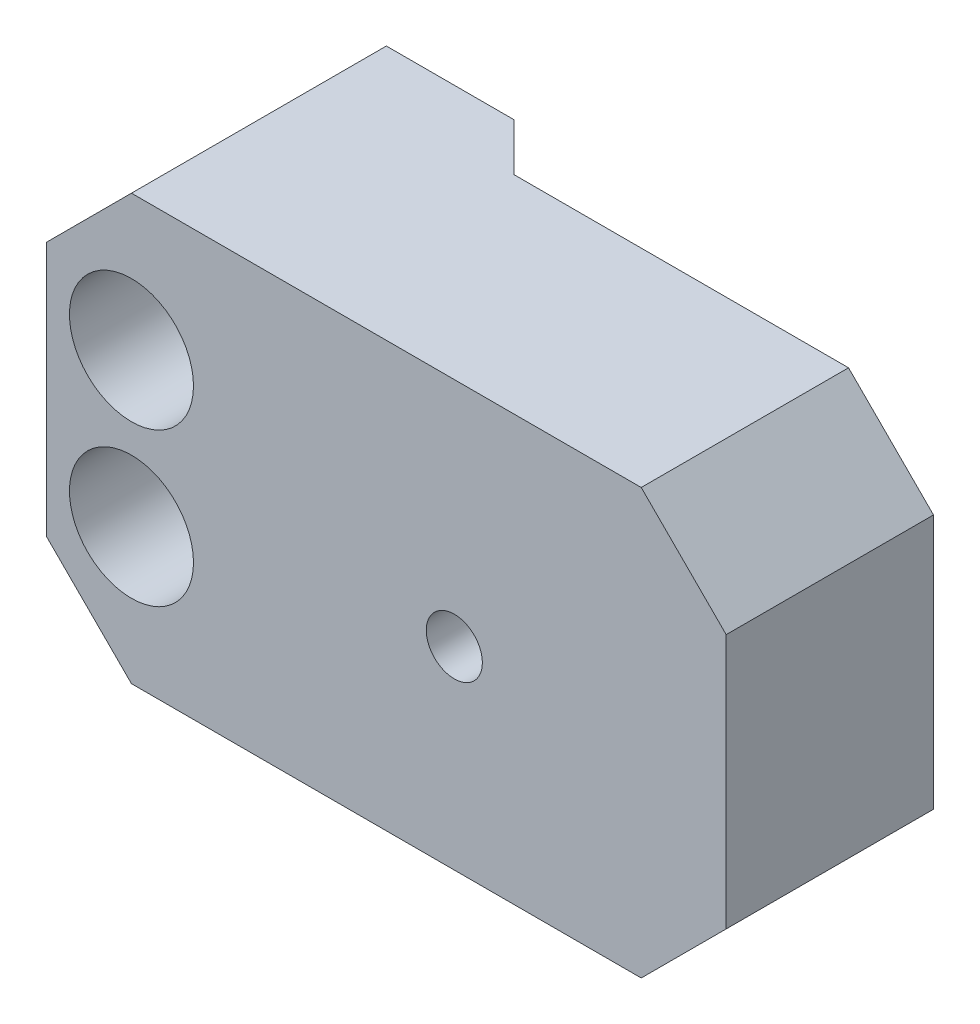
ISO-10303-21;
HEADER;
FILE_DESCRIPTION(('STEP AP214'),'2;1');
FILE_NAME('part.step','',(''),(''),'','','');
FILE_SCHEMA(('AUTOMOTIVE_DESIGN { 1 0 10303 214 1 1 1 1 }'));
ENDSEC;
DATA;
#1=APPLICATION_CONTEXT('core data for automotive mechanical design processes');
#2=APPLICATION_PROTOCOL_DEFINITION('international standard','automotive_design',2000,#1);
#3=PRODUCT_CONTEXT('',#1,'mechanical');
#4=PRODUCT('Part','Part','',(#3));
#5=PRODUCT_RELATED_PRODUCT_CATEGORY('part','',(#4));
#6=PRODUCT_DEFINITION_FORMATION('','',#4);
#7=PRODUCT_DEFINITION_CONTEXT('part definition',#1,'design');
#8=PRODUCT_DEFINITION('design','',#6,#7);
#9=PRODUCT_DEFINITION_SHAPE('','',#8);
#10=(LENGTH_UNIT() NAMED_UNIT(*) SI_UNIT(.MILLI.,.METRE.));
#11=(NAMED_UNIT(*) PLANE_ANGLE_UNIT() SI_UNIT($,.RADIAN.));
#12=(NAMED_UNIT(*) SI_UNIT($,.STERADIAN.) SOLID_ANGLE_UNIT());
#13=UNCERTAINTY_MEASURE_WITH_UNIT(LENGTH_MEASURE(1.E-05),#10,'distance_accuracy_value','');
#14=(GEOMETRIC_REPRESENTATION_CONTEXT(3) GLOBAL_UNCERTAINTY_ASSIGNED_CONTEXT((#13)) GLOBAL_UNIT_ASSIGNED_CONTEXT((#10,
#11,#12)) REPRESENTATION_CONTEXT('',''));
#15=CARTESIAN_POINT('',(0.,0.,0.));
#16=DIRECTION('',(0.,0.,1.));
#17=DIRECTION('',(1.,0.,0.));
#18=AXIS2_PLACEMENT_3D('',#15,#16,#17);
#19=CARTESIAN_POINT('',(-19.,-3.39389348937327,46.));
#20=DIRECTION('',(0.,0.,-1.));
#21=DIRECTION('',(-1.,0.,0.));
#22=AXIS2_PLACEMENT_3D('',#19,#20,#21);
#23=CYLINDRICAL_SURFACE('',#22,1.75);
#24=CARTESIAN_POINT('',(-19.,-3.39389348937327,31.));
#25=DIRECTION('',(0.,0.,1.));
#26=DIRECTION('',(1.,0.,0.));
#27=AXIS2_PLACEMENT_3D('',#24,#25,#26);
#28=CIRCLE('',#27,1.75);
#29=CARTESIAN_POINT('',(-17.25,-3.39389348937327,31.));
#30=VERTEX_POINT('',#29);
#31=EDGE_CURVE('E269',#30,#30,#28,.T.);
#32=ORIENTED_EDGE('',*,*,#31,.F.);
#33=EDGE_LOOP('',(#32));
#34=FACE_BOUND('',#33,.T.);
#35=CARTESIAN_POINT('',(-19.,-3.39389348937327,34.5));
#36=DIRECTION('',(0.,0.,1.));
#37=DIRECTION('',(1.,0.,0.));
#38=AXIS2_PLACEMENT_3D('',#35,#36,#37);
#39=CIRCLE('',#38,1.75);
#40=CARTESIAN_POINT('',(-17.25,-3.39389348937327,34.5));
#41=VERTEX_POINT('',#40);
#42=EDGE_CURVE('E327',#41,#41,#39,.F.);
#43=ORIENTED_EDGE('',*,*,#42,.F.);
#44=EDGE_LOOP('',(#43));
#45=FACE_BOUND('',#44,.T.);
#46=ADVANCED_FACE('F39',(#34,#45),#23,.F.);
#47=CARTESIAN_POINT('',(-19.,5.60610651062673,46.));
#48=DIRECTION('',(0.,0.,-1.));
#49=DIRECTION('',(-1.,0.,0.));
#50=AXIS2_PLACEMENT_3D('',#47,#48,#49);
#51=CYLINDRICAL_SURFACE('',#50,1.75);
#52=CARTESIAN_POINT('',(-19.,5.60610651062673,31.));
#53=DIRECTION('',(0.,0.,1.));
#54=DIRECTION('',(1.,0.,0.));
#55=AXIS2_PLACEMENT_3D('',#52,#53,#54);
#56=CIRCLE('',#55,1.75);
#57=CARTESIAN_POINT('',(-17.25,5.60610651062673,31.));
#58=VERTEX_POINT('',#57);
#59=EDGE_CURVE('E265',#58,#58,#56,.T.);
#60=ORIENTED_EDGE('',*,*,#59,.F.);
#61=EDGE_LOOP('',(#60));
#62=FACE_BOUND('',#61,.T.);
#63=CARTESIAN_POINT('',(-19.,5.60610651062673,34.5));
#64=DIRECTION('',(0.,0.,1.));
#65=DIRECTION('',(1.,0.,0.));
#66=AXIS2_PLACEMENT_3D('',#63,#64,#65);
#67=CIRCLE('',#66,1.75);
#68=CARTESIAN_POINT('',(-17.25,5.60610651062673,34.5));
#69=VERTEX_POINT('',#68);
#70=EDGE_CURVE('E320',#69,#69,#67,.T.);
#71=ORIENTED_EDGE('',*,*,#70,.T.);
#72=EDGE_LOOP('',(#71));
#73=FACE_BOUND('',#72,.T.);
#74=ADVANCED_FACE('F163',(#62,#73),#51,.F.);
#75=CARTESIAN_POINT('',(0.,0.,46.));
#76=DIRECTION('',(0.,0.,-1.));
#77=DIRECTION('',(-1.,0.,0.));
#78=AXIS2_PLACEMENT_3D('',#75,#76,#77);
#79=CYLINDRICAL_SURFACE('',#78,4.9);
#80=CARTESIAN_POINT('',(0.,0.,34.8));
#81=DIRECTION('',(0.,0.,1.));
#82=DIRECTION('',(1.,0.,0.));
#83=AXIS2_PLACEMENT_3D('',#80,#81,#82);
#84=CIRCLE('',#83,4.9);
#85=CARTESIAN_POINT('',(4.9,0.,34.8));
#86=VERTEX_POINT('',#85);
#87=EDGE_CURVE('E138',#86,#86,#84,.F.);
#88=ORIENTED_EDGE('',*,*,#87,.T.);
#89=EDGE_LOOP('',(#88));
#90=FACE_BOUND('',#89,.T.);
#91=CARTESIAN_POINT('',(0.,0.,42.5));
#92=DIRECTION('',(0.,0.,1.));
#93=DIRECTION('',(1.,0.,0.));
#94=AXIS2_PLACEMENT_3D('',#91,#92,#93);
#95=CIRCLE('',#94,4.9);
#96=CARTESIAN_POINT('',(4.9,0.,42.5));
#97=VERTEX_POINT('',#96);
#98=EDGE_CURVE('E256',#97,#97,#95,.F.);
#99=ORIENTED_EDGE('',*,*,#98,.F.);
#100=EDGE_LOOP('',(#99));
#101=FACE_BOUND('',#100,.T.);
#102=ADVANCED_FACE('F169',(#90,#101),#79,.F.);
#103=CARTESIAN_POINT('',(0.,0.,46.));
#104=DIRECTION('',(0.,0.,1.));
#105=DIRECTION('',(1.,0.,0.));
#106=AXIS2_PLACEMENT_3D('',#103,#104,#105);
#107=PLANE('',#106);
#108=CARTESIAN_POINT('',(-19.,-3.39389348937327,46.));
#109=DIRECTION('',(0.,0.,1.));
#110=DIRECTION('',(1.,0.,0.));
#111=AXIS2_PLACEMENT_3D('',#108,#109,#110);
#112=CIRCLE('',#111,3.65);
#113=CARTESIAN_POINT('',(-15.35,-3.39389348937327,46.));
#114=VERTEX_POINT('',#113);
#115=EDGE_CURVE('E330',#114,#114,#112,.T.);
#116=ORIENTED_EDGE('',*,*,#115,.F.);
#117=EDGE_LOOP('',(#116));
#118=FACE_BOUND('',#117,.T.);
#119=CARTESIAN_POINT('',(-19.,5.60610651062673,46.));
#120=DIRECTION('',(0.,0.,1.));
#121=DIRECTION('',(1.,0.,0.));
#122=AXIS2_PLACEMENT_3D('',#119,#120,#121);
#123=CIRCLE('',#122,3.65);
#124=CARTESIAN_POINT('',(-15.35,5.60610651062673,46.));
#125=VERTEX_POINT('',#124);
#126=EDGE_CURVE('E335',#125,#125,#123,.T.);
#127=ORIENTED_EDGE('',*,*,#126,.F.);
#128=EDGE_LOOP('',(#127));
#129=FACE_BOUND('',#128,.T.);
#130=DIRECTION('',(0.,-1.,0.));
#131=VECTOR('',#130,1.);
#132=CARTESIAN_POINT('',(-24.,13.6061065106267,46.));
#133=LINE('',#132,#131);
#134=CARTESIAN_POINT('',(-24.,8.60610651062673,46.));
#135=VERTEX_POINT('',#134);
#136=CARTESIAN_POINT('',(-24.,-6.39389348937327,46.));
#137=VERTEX_POINT('',#136);
#138=EDGE_CURVE('E272',#135,#137,#133,.T.);
#139=ORIENTED_EDGE('',*,*,#138,.T.);
#140=DIRECTION('',(-0.707106781186546,0.707106781186549,0.));
#141=VECTOR('',#140,1.);
#142=CARTESIAN_POINT('',(-15.1969467446867,-15.1969467446866,46.));
#143=LINE('',#142,#141);
#144=CARTESIAN_POINT('',(-19.,-11.3938934893733,46.));
#145=VERTEX_POINT('',#144);
#146=EDGE_CURVE('E305',#137,#145,#143,.F.);
#147=ORIENTED_EDGE('',*,*,#146,.T.);
#148=DIRECTION('',(1.,0.,0.));
#149=VECTOR('',#148,1.);
#150=CARTESIAN_POINT('',(-24.,-11.3938934893733,46.));
#151=LINE('',#150,#149);
#152=CARTESIAN_POINT('',(11.,-11.3938934893733,46.));
#153=VERTEX_POINT('',#152);
#154=EDGE_CURVE('E275',#145,#153,#151,.T.);
#155=ORIENTED_EDGE('',*,*,#154,.T.);
#156=DIRECTION('',(-0.707106781186548,-0.707106781186547,0.));
#157=VECTOR('',#156,1.);
#158=CARTESIAN_POINT('',(11.1969467446866,-11.1969467446866,46.));
#159=LINE('',#158,#157);
#160=CARTESIAN_POINT('',(16.,-6.39389348937328,46.));
#161=VERTEX_POINT('',#160);
#162=EDGE_CURVE('E303',#153,#161,#159,.F.);
#163=ORIENTED_EDGE('',*,*,#162,.T.);
#164=DIRECTION('',(0.,1.,0.));
#165=VECTOR('',#164,1.);
#166=CARTESIAN_POINT('',(16.,13.6061065106267,46.));
#167=LINE('',#166,#165);
#168=CARTESIAN_POINT('',(16.,8.60610651062671,46.));
#169=VERTEX_POINT('',#168);
#170=EDGE_CURVE('E278',#161,#169,#167,.T.);
#171=ORIENTED_EDGE('',*,*,#170,.T.);
#172=DIRECTION('',(0.707106781186546,-0.707106781186549,0.));
#173=VECTOR('',#172,1.);
#174=CARTESIAN_POINT('',(12.3030532553134,12.3030532553133,46.));
#175=LINE('',#174,#173);
#176=CARTESIAN_POINT('',(11.,13.6061065106267,46.));
#177=VERTEX_POINT('',#176);
#178=EDGE_CURVE('E301',#169,#177,#175,.F.);
#179=ORIENTED_EDGE('',*,*,#178,.T.);
#180=DIRECTION('',(-1.,0.,0.));
#181=VECTOR('',#180,1.);
#182=CARTESIAN_POINT('',(-24.,13.6061065106267,46.));
#183=LINE('',#182,#181);
#184=CARTESIAN_POINT('',(-19.,13.6061065106267,46.));
#185=VERTEX_POINT('',#184);
#186=EDGE_CURVE('E281',#177,#185,#183,.T.);
#187=ORIENTED_EDGE('',*,*,#186,.T.);
#188=DIRECTION('',(0.707106781186549,0.707106781186547,0.));
#189=VECTOR('',#188,1.);
#190=CARTESIAN_POINT('',(-16.3030532553133,16.3030532553134,46.));
#191=LINE('',#190,#189);
#192=EDGE_CURVE('E299',#185,#135,#191,.F.);
#193=ORIENTED_EDGE('',*,*,#192,.T.);
#194=EDGE_LOOP('',(#139,#147,#155,#163,#171,#179,#187,#193));
#195=FACE_BOUND('',#194,.T.);
#196=CARTESIAN_POINT('',(0.,0.,46.));
#197=DIRECTION('',(0.,0.,1.));
#198=DIRECTION('',(1.,0.,0.));
#199=AXIS2_PLACEMENT_3D('',#196,#197,#198);
#200=CIRCLE('',#199,1.65);
#201=CARTESIAN_POINT('',(1.65,0.,46.));
#202=VERTEX_POINT('',#201);
#203=EDGE_CURVE('E260',#202,#202,#200,.T.);
#204=ORIENTED_EDGE('',*,*,#203,.F.);
#205=EDGE_LOOP('',(#204));
#206=FACE_BOUND('',#205,.T.);
#207=ADVANCED_FACE('F178',(#118,#129,#195,#206),#107,.T.);
#208=CARTESIAN_POINT('',(0.,0.,31.));
#209=DIRECTION('',(0.,0.,1.));
#210=DIRECTION('',(1.,0.,0.));
#211=AXIS2_PLACEMENT_3D('',#208,#209,#210);
#212=PLANE('',#211);
#213=DIRECTION('',(1.,0.,0.));
#214=VECTOR('',#213,1.);
#215=CARTESIAN_POINT('',(-24.,-11.3938934893733,31.));
#216=LINE('',#215,#214);
#217=CARTESIAN_POINT('',(-19.,-11.3938934893733,31.));
#218=VERTEX_POINT('',#217);
#219=CARTESIAN_POINT('',(-11.5,-11.3938934893733,31.));
#220=VERTEX_POINT('',#219);
#221=EDGE_CURVE('E118',#218,#220,#216,.T.);
#222=ORIENTED_EDGE('',*,*,#221,.F.);
#223=DIRECTION('',(0.707106781186546,-0.707106781186549,0.));
#224=VECTOR('',#223,1.);
#225=CARTESIAN_POINT('',(-19.,-11.3938934893733,31.));
#226=LINE('',#225,#224);
#227=CARTESIAN_POINT('',(-24.,-6.39389348937327,31.));
#228=VERTEX_POINT('',#227);
#229=EDGE_CURVE('E292',#218,#228,#226,.F.);
#230=ORIENTED_EDGE('',*,*,#229,.T.);
#231=DIRECTION('',(0.,-1.,0.));
#232=VECTOR('',#231,1.);
#233=CARTESIAN_POINT('',(-24.,13.6061065106267,31.));
#234=LINE('',#233,#232);
#235=CARTESIAN_POINT('',(-24.,8.60610651062673,31.));
#236=VERTEX_POINT('',#235);
#237=EDGE_CURVE('E126',#236,#228,#234,.T.);
#238=ORIENTED_EDGE('',*,*,#237,.F.);
#239=DIRECTION('',(-0.707106781186549,-0.707106781186547,0.));
#240=VECTOR('',#239,1.);
#241=CARTESIAN_POINT('',(-24.,8.60610651062673,31.));
#242=LINE('',#241,#240);
#243=CARTESIAN_POINT('',(-19.,13.6061065106267,31.));
#244=VERTEX_POINT('',#243);
#245=EDGE_CURVE('E290',#236,#244,#242,.F.);
#246=ORIENTED_EDGE('',*,*,#245,.T.);
#247=DIRECTION('',(-1.,0.,0.));
#248=VECTOR('',#247,1.);
#249=CARTESIAN_POINT('',(-24.,13.6061065106267,31.));
#250=LINE('',#249,#248);
#251=CARTESIAN_POINT('',(-11.5,13.6061065106267,31.));
#252=VERTEX_POINT('',#251);
#253=EDGE_CURVE('E125',#252,#244,#250,.T.);
#254=ORIENTED_EDGE('',*,*,#253,.F.);
#255=DIRECTION('',(0.,1.,0.));
#256=VECTOR('',#255,1.);
#257=CARTESIAN_POINT('',(-11.5,-114.394893489373,31.));
#258=LINE('',#257,#256);
#259=EDGE_CURVE('E129',#220,#252,#258,.T.);
#260=ORIENTED_EDGE('',*,*,#259,.F.);
#261=EDGE_LOOP('',(#222,#230,#238,#246,#254,#260));
#262=FACE_BOUND('',#261,.T.);
#263=ORIENTED_EDGE('',*,*,#31,.T.);
#264=EDGE_LOOP('',(#263));
#265=FACE_BOUND('',#264,.T.);
#266=ORIENTED_EDGE('',*,*,#59,.T.);
#267=EDGE_LOOP('',(#266));
#268=FACE_BOUND('',#267,.T.);
#269=ADVANCED_FACE('F130',(#262,#265,#268),#212,.F.);
#270=CARTESIAN_POINT('',(-24.,13.6061065106267,46.));
#271=DIRECTION('',(1.,0.,0.));
#272=DIRECTION('',(0.,1.,0.));
#273=AXIS2_PLACEMENT_3D('',#270,#271,#272);
#274=PLANE('',#273);
#275=ORIENTED_EDGE('',*,*,#237,.T.);
#276=DIRECTION('',(0.,0.,1.));
#277=VECTOR('',#276,1.);
#278=CARTESIAN_POINT('',(-24.,-6.39389348937327,46.));
#279=LINE('',#278,#277);
#280=EDGE_CURVE('E297',#228,#137,#279,.T.);
#281=ORIENTED_EDGE('',*,*,#280,.T.);
#282=ORIENTED_EDGE('',*,*,#138,.F.);
#283=DIRECTION('',(0.,0.,-1.));
#284=VECTOR('',#283,1.);
#285=CARTESIAN_POINT('',(-24.,8.60610651062673,46.));
#286=LINE('',#285,#284);
#287=EDGE_CURVE('E294',#135,#236,#286,.T.);
#288=ORIENTED_EDGE('',*,*,#287,.T.);
#289=EDGE_LOOP('',(#275,#281,#282,#288));
#290=FACE_BOUND('',#289,.T.);
#291=ADVANCED_FACE('F185',(#290),#274,.F.);
#292=CARTESIAN_POINT('',(-24.,-11.3938934893733,46.));
#293=DIRECTION('',(0.,1.,0.));
#294=DIRECTION('',(0.,0.,1.));
#295=AXIS2_PLACEMENT_3D('',#292,#293,#294);
#296=PLANE('',#295);
#297=ORIENTED_EDGE('',*,*,#154,.F.);
#298=DIRECTION('',(0.,0.,-1.));
#299=VECTOR('',#298,1.);
#300=CARTESIAN_POINT('',(-19.,-11.3938934893733,46.));
#301=LINE('',#300,#299);
#302=EDGE_CURVE('E123',#145,#218,#301,.T.);
#303=ORIENTED_EDGE('',*,*,#302,.T.);
#304=ORIENTED_EDGE('',*,*,#221,.T.);
#305=DIRECTION('',(-0.707106781186552,0.,-0.707106781186543));
#306=VECTOR('',#305,1.);
#307=CARTESIAN_POINT('',(-10.2500000000001,-11.3938934893733,32.2499999999999));
#308=LINE('',#307,#306);
#309=CARTESIAN_POINT('',(-8.69999999999997,-11.3938934893733,33.8));
#310=VERTEX_POINT('',#309);
#311=EDGE_CURVE('E63',#220,#310,#308,.F.);
#312=ORIENTED_EDGE('',*,*,#311,.T.);
#313=DIRECTION('',(-1.,0.,0.));
#314=VECTOR('',#313,1.);
#315=CARTESIAN_POINT('',(16.,-11.3938934893733,33.8));
#316=LINE('',#315,#314);
#317=CARTESIAN_POINT('',(11.,-11.3938934893733,33.8));
#318=VERTEX_POINT('',#317);
#319=EDGE_CURVE('E251',#318,#310,#316,.T.);
#320=ORIENTED_EDGE('',*,*,#319,.F.);
#321=DIRECTION('',(0.,0.,1.));
#322=VECTOR('',#321,1.);
#323=CARTESIAN_POINT('',(11.,-11.3938934893733,46.));
#324=LINE('',#323,#322);
#325=EDGE_CURVE('E284',#318,#153,#324,.T.);
#326=ORIENTED_EDGE('',*,*,#325,.T.);
#327=EDGE_LOOP('',(#297,#303,#304,#312,#320,#326));
#328=FACE_BOUND('',#327,.T.);
#329=ADVANCED_FACE('F121',(#328),#296,.F.);
#330=CARTESIAN_POINT('',(16.,13.6061065106267,46.));
#331=DIRECTION('',(-1.,0.,0.));
#332=DIRECTION('',(0.,-1.,0.));
#333=AXIS2_PLACEMENT_3D('',#330,#331,#332);
#334=PLANE('',#333);
#335=ORIENTED_EDGE('',*,*,#170,.F.);
#336=DIRECTION('',(0.,0.,-1.));
#337=VECTOR('',#336,1.);
#338=CARTESIAN_POINT('',(16.,-6.39389348937328,46.));
#339=LINE('',#338,#337);
#340=CARTESIAN_POINT('',(16.,-6.39389348937328,33.8));
#341=VERTEX_POINT('',#340);
#342=EDGE_CURVE('E309',#161,#341,#339,.T.);
#343=ORIENTED_EDGE('',*,*,#342,.T.);
#344=DIRECTION('',(0.,1.,0.));
#345=VECTOR('',#344,1.);
#346=CARTESIAN_POINT('',(16.,-114.394893489373,33.8));
#347=LINE('',#346,#345);
#348=CARTESIAN_POINT('',(16.,8.60610651062671,33.8));
#349=VERTEX_POINT('',#348);
#350=EDGE_CURVE('E133',#341,#349,#347,.T.);
#351=ORIENTED_EDGE('',*,*,#350,.T.);
#352=DIRECTION('',(0.,0.,1.));
#353=VECTOR('',#352,1.);
#354=CARTESIAN_POINT('',(16.,8.60610651062671,46.));
#355=LINE('',#354,#353);
#356=EDGE_CURVE('E307',#349,#169,#355,.T.);
#357=ORIENTED_EDGE('',*,*,#356,.T.);
#358=EDGE_LOOP('',(#335,#343,#351,#357));
#359=FACE_BOUND('',#358,.T.);
#360=ADVANCED_FACE('F190',(#359),#334,.F.);
#361=CARTESIAN_POINT('',(-24.,13.6061065106267,46.));
#362=DIRECTION('',(0.,-1.,0.));
#363=DIRECTION('',(0.,0.,-1.));
#364=AXIS2_PLACEMENT_3D('',#361,#362,#363);
#365=PLANE('',#364);
#366=ORIENTED_EDGE('',*,*,#186,.F.);
#367=DIRECTION('',(0.,0.,-1.));
#368=VECTOR('',#367,1.);
#369=CARTESIAN_POINT('',(11.,13.6061065106267,46.));
#370=LINE('',#369,#368);
#371=CARTESIAN_POINT('',(11.,13.6061065106267,33.8));
#372=VERTEX_POINT('',#371);
#373=EDGE_CURVE('E317',#177,#372,#370,.T.);
#374=ORIENTED_EDGE('',*,*,#373,.T.);
#375=DIRECTION('',(1.,0.,0.));
#376=VECTOR('',#375,1.);
#377=CARTESIAN_POINT('',(16.,13.6061065106267,33.8));
#378=LINE('',#377,#376);
#379=CARTESIAN_POINT('',(-8.69999999999997,13.6061065106267,33.8));
#380=VERTEX_POINT('',#379);
#381=EDGE_CURVE('E134',#380,#372,#378,.T.);
#382=ORIENTED_EDGE('',*,*,#381,.F.);
#383=DIRECTION('',(0.707106781186552,0.,0.707106781186543));
#384=VECTOR('',#383,1.);
#385=CARTESIAN_POINT('',(-10.2500000000001,13.6061065106267,32.2499999999999));
#386=LINE('',#385,#384);
#387=EDGE_CURVE('E55',#380,#252,#386,.F.);
#388=ORIENTED_EDGE('',*,*,#387,.T.);
#389=ORIENTED_EDGE('',*,*,#253,.T.);
#390=DIRECTION('',(0.,0.,1.));
#391=VECTOR('',#390,1.);
#392=CARTESIAN_POINT('',(-19.,13.6061065106267,46.));
#393=LINE('',#392,#391);
#394=EDGE_CURVE('E315',#244,#185,#393,.T.);
#395=ORIENTED_EDGE('',*,*,#394,.T.);
#396=EDGE_LOOP('',(#366,#374,#382,#388,#389,#395));
#397=FACE_BOUND('',#396,.T.);
#398=ADVANCED_FACE('F186',(#397),#365,.F.);
#399=CARTESIAN_POINT('',(16.,-114.394893489373,33.8));
#400=DIRECTION('',(0.,0.,1.));
#401=DIRECTION('',(1.,0.,0.));
#402=AXIS2_PLACEMENT_3D('',#399,#400,#401);
#403=PLANE('',#402);
#404=CARTESIAN_POINT('',(0.,0.,33.8));
#405=DIRECTION('',(0.,0.,1.));
#406=DIRECTION('',(1.,0.,0.));
#407=AXIS2_PLACEMENT_3D('',#404,#405,#406);
#408=CIRCLE('',#407,5.90000000000002);
#409=CARTESIAN_POINT('',(5.90000000000002,0.,33.8));
#410=VERTEX_POINT('',#409);
#411=EDGE_CURVE('E141',#410,#410,#408,.T.);
#412=ORIENTED_EDGE('',*,*,#411,.T.);
#413=EDGE_LOOP('',(#412));
#414=FACE_BOUND('',#413,.T.);
#415=ORIENTED_EDGE('',*,*,#319,.T.);
#416=DIRECTION('',(0.,1.,0.));
#417=VECTOR('',#416,1.);
#418=CARTESIAN_POINT('',(-8.69999999999997,13.6061065106267,33.8));
#419=LINE('',#418,#417);
#420=EDGE_CURVE('E137',#310,#380,#419,.T.);
#421=ORIENTED_EDGE('',*,*,#420,.T.);
#422=ORIENTED_EDGE('',*,*,#381,.T.);
#423=DIRECTION('',(-0.707106781186546,0.707106781186549,0.));
#424=VECTOR('',#423,1.);
#425=CARTESIAN_POINT('',(11.,13.6061065106267,33.8));
#426=LINE('',#425,#424);
#427=EDGE_CURVE('E312',#372,#349,#426,.F.);
#428=ORIENTED_EDGE('',*,*,#427,.T.);
#429=ORIENTED_EDGE('',*,*,#350,.F.);
#430=DIRECTION('',(0.707106781186548,0.707106781186547,0.));
#431=VECTOR('',#430,1.);
#432=CARTESIAN_POINT('',(16.,-6.39389348937328,33.8));
#433=LINE('',#432,#431);
#434=EDGE_CURVE('E254',#341,#318,#433,.F.);
#435=ORIENTED_EDGE('',*,*,#434,.T.);
#436=EDGE_LOOP('',(#415,#421,#422,#428,#429,#435));
#437=FACE_BOUND('',#436,.T.);
#438=ADVANCED_FACE('F189',(#414,#437),#403,.F.);
#439=CARTESIAN_POINT('',(-19.,-11.3938934893733,46.));
#440=DIRECTION('',(0.707106781186549,0.707106781186546,0.));
#441=DIRECTION('',(0.,0.,-1.));
#442=AXIS2_PLACEMENT_3D('',#439,#440,#441);
#443=PLANE('',#442);
#444=ORIENTED_EDGE('',*,*,#146,.F.);
#445=ORIENTED_EDGE('',*,*,#280,.F.);
#446=ORIENTED_EDGE('',*,*,#229,.F.);
#447=ORIENTED_EDGE('',*,*,#302,.F.);
#448=EDGE_LOOP('',(#444,#445,#446,#447));
#449=FACE_BOUND('',#448,.T.);
#450=ADVANCED_FACE('F200',(#449),#443,.F.);
#451=CARTESIAN_POINT('',(16.,-6.39389348937328,46.));
#452=DIRECTION('',(-0.707106781186547,0.707106781186548,0.));
#453=DIRECTION('',(0.,0.,-1.));
#454=AXIS2_PLACEMENT_3D('',#451,#452,#453);
#455=PLANE('',#454);
#456=ORIENTED_EDGE('',*,*,#162,.F.);
#457=ORIENTED_EDGE('',*,*,#325,.F.);
#458=ORIENTED_EDGE('',*,*,#434,.F.);
#459=ORIENTED_EDGE('',*,*,#342,.F.);
#460=EDGE_LOOP('',(#456,#457,#458,#459));
#461=FACE_BOUND('',#460,.T.);
#462=ADVANCED_FACE('F203',(#461),#455,.F.);
#463=CARTESIAN_POINT('',(11.,13.6061065106267,46.));
#464=DIRECTION('',(-0.707106781186549,-0.707106781186546,0.));
#465=DIRECTION('',(0.,0.,-1.));
#466=AXIS2_PLACEMENT_3D('',#463,#464,#465);
#467=PLANE('',#466);
#468=ORIENTED_EDGE('',*,*,#178,.F.);
#469=ORIENTED_EDGE('',*,*,#356,.F.);
#470=ORIENTED_EDGE('',*,*,#427,.F.);
#471=ORIENTED_EDGE('',*,*,#373,.F.);
#472=EDGE_LOOP('',(#468,#469,#470,#471));
#473=FACE_BOUND('',#472,.T.);
#474=ADVANCED_FACE('F207',(#473),#467,.F.);
#475=CARTESIAN_POINT('',(-24.,8.60610651062673,46.));
#476=DIRECTION('',(0.707106781186546,-0.707106781186548,0.));
#477=DIRECTION('',(0.,0.,-1.));
#478=AXIS2_PLACEMENT_3D('',#475,#476,#477);
#479=PLANE('',#478);
#480=ORIENTED_EDGE('',*,*,#192,.F.);
#481=ORIENTED_EDGE('',*,*,#394,.F.);
#482=ORIENTED_EDGE('',*,*,#245,.F.);
#483=ORIENTED_EDGE('',*,*,#287,.F.);
#484=EDGE_LOOP('',(#480,#481,#482,#483));
#485=FACE_BOUND('',#484,.T.);
#486=ADVANCED_FACE('F211',(#485),#479,.F.);
#487=CARTESIAN_POINT('',(0.,0.,42.5));
#488=DIRECTION('',(0.,0.,1.));
#489=DIRECTION('',(1.,0.,0.));
#490=AXIS2_PLACEMENT_3D('',#487,#488,#489);
#491=PLANE('',#490);
#492=CARTESIAN_POINT('',(0.,0.,42.5));
#493=DIRECTION('',(0.,0.,1.));
#494=DIRECTION('',(1.,0.,0.));
#495=AXIS2_PLACEMENT_3D('',#492,#493,#494);
#496=CIRCLE('',#495,2.65);
#497=CARTESIAN_POINT('',(2.65,0.,42.5));
#498=VERTEX_POINT('',#497);
#499=EDGE_CURVE('E48',#498,#498,#496,.T.);
#500=ORIENTED_EDGE('',*,*,#499,.T.);
#501=EDGE_LOOP('',(#500));
#502=FACE_BOUND('',#501,.T.);
#503=ORIENTED_EDGE('',*,*,#98,.T.);
#504=EDGE_LOOP('',(#503));
#505=FACE_BOUND('',#504,.T.);
#506=ADVANCED_FACE('F151',(#502,#505),#491,.F.);
#507=CARTESIAN_POINT('',(0.,0.,42.5));
#508=DIRECTION('',(0.,0.,1.));
#509=DIRECTION('',(1.,0.,0.));
#510=AXIS2_PLACEMENT_3D('',#507,#508,#509);
#511=CYLINDRICAL_SURFACE('',#510,1.65);
#512=CARTESIAN_POINT('',(0.,0.,43.5));
#513=DIRECTION('',(0.,0.,1.));
#514=DIRECTION('',(1.,0.,0.));
#515=AXIS2_PLACEMENT_3D('',#512,#513,#514);
#516=CIRCLE('',#515,1.65);
#517=CARTESIAN_POINT('',(1.65,0.,43.5));
#518=VERTEX_POINT('',#517);
#519=EDGE_CURVE('E11',#518,#518,#516,.F.);
#520=ORIENTED_EDGE('',*,*,#519,.T.);
#521=EDGE_LOOP('',(#520));
#522=FACE_BOUND('',#521,.T.);
#523=ORIENTED_EDGE('',*,*,#203,.T.);
#524=EDGE_LOOP('',(#523));
#525=FACE_BOUND('',#524,.T.);
#526=ADVANCED_FACE('F236',(#522,#525),#511,.F.);
#527=CARTESIAN_POINT('',(-19.,5.60610651062673,34.5));
#528=DIRECTION('',(0.,0.,1.));
#529=DIRECTION('',(1.,0.,0.));
#530=AXIS2_PLACEMENT_3D('',#527,#528,#529);
#531=CYLINDRICAL_SURFACE('',#530,3.65);
#532=CARTESIAN_POINT('',(-19.,5.60610651062673,34.5));
#533=DIRECTION('',(0.,0.,1.));
#534=DIRECTION('',(1.,0.,0.));
#535=AXIS2_PLACEMENT_3D('',#532,#533,#534);
#536=CIRCLE('',#535,3.65);
#537=CARTESIAN_POINT('',(-15.35,5.60610651062673,34.5));
#538=VERTEX_POINT('',#537);
#539=EDGE_CURVE('E338',#538,#538,#536,.T.);
#540=ORIENTED_EDGE('',*,*,#539,.F.);
#541=EDGE_LOOP('',(#540));
#542=FACE_BOUND('',#541,.T.);
#543=ORIENTED_EDGE('',*,*,#126,.T.);
#544=EDGE_LOOP('',(#543));
#545=FACE_BOUND('',#544,.T.);
#546=ADVANCED_FACE('F233',(#542,#545),#531,.F.);
#547=CARTESIAN_POINT('',(-19.,5.60610651062673,34.5));
#548=DIRECTION('',(0.,0.,1.));
#549=DIRECTION('',(1.,0.,0.));
#550=AXIS2_PLACEMENT_3D('',#547,#548,#549);
#551=PLANE('',#550);
#552=ORIENTED_EDGE('',*,*,#70,.F.);
#553=EDGE_LOOP('',(#552));
#554=FACE_BOUND('',#553,.T.);
#555=ORIENTED_EDGE('',*,*,#539,.T.);
#556=EDGE_LOOP('',(#555));
#557=FACE_BOUND('',#556,.T.);
#558=ADVANCED_FACE('F227',(#554,#557),#551,.T.);
#559=CARTESIAN_POINT('',(-19.,-3.39389348937327,34.5));
#560=DIRECTION('',(0.,0.,1.));
#561=DIRECTION('',(1.,0.,0.));
#562=AXIS2_PLACEMENT_3D('',#559,#560,#561);
#563=CYLINDRICAL_SURFACE('',#562,3.65);
#564=CARTESIAN_POINT('',(-19.,-3.39389348937327,34.5));
#565=DIRECTION('',(0.,0.,1.));
#566=DIRECTION('',(1.,0.,0.));
#567=AXIS2_PLACEMENT_3D('',#564,#565,#566);
#568=CIRCLE('',#567,3.65);
#569=CARTESIAN_POINT('',(-15.35,-3.39389348937327,34.5));
#570=VERTEX_POINT('',#569);
#571=EDGE_CURVE('E322',#570,#570,#568,.T.);
#572=ORIENTED_EDGE('',*,*,#571,.F.);
#573=EDGE_LOOP('',(#572));
#574=FACE_BOUND('',#573,.T.);
#575=ORIENTED_EDGE('',*,*,#115,.T.);
#576=EDGE_LOOP('',(#575));
#577=FACE_BOUND('',#576,.T.);
#578=ADVANCED_FACE('F221',(#574,#577),#563,.F.);
#579=CARTESIAN_POINT('',(0.,0.,34.5));
#580=DIRECTION('',(0.,0.,1.));
#581=DIRECTION('',(1.,0.,0.));
#582=AXIS2_PLACEMENT_3D('',#579,#580,#581);
#583=PLANE('',#582);
#584=ORIENTED_EDGE('',*,*,#42,.T.);
#585=EDGE_LOOP('',(#584));
#586=FACE_BOUND('',#585,.T.);
#587=ORIENTED_EDGE('',*,*,#571,.T.);
#588=EDGE_LOOP('',(#587));
#589=FACE_BOUND('',#588,.T.);
#590=ADVANCED_FACE('F217',(#586,#589),#583,.T.);
#591=CARTESIAN_POINT('',(-8.69999999999997,-114.394893489373,33.8));
#592=DIRECTION('',(0.707106781186543,0.,-0.707106781186552));
#593=DIRECTION('',(0.,-1.,0.));
#594=AXIS2_PLACEMENT_3D('',#591,#592,#593);
#595=PLANE('',#594);
#596=ORIENTED_EDGE('',*,*,#311,.F.);
#597=ORIENTED_EDGE('',*,*,#259,.T.);
#598=ORIENTED_EDGE('',*,*,#387,.F.);
#599=ORIENTED_EDGE('',*,*,#420,.F.);
#600=EDGE_LOOP('',(#596,#597,#598,#599));
#601=FACE_BOUND('',#600,.T.);
#602=ADVANCED_FACE('F136',(#601),#595,.T.);
#603=CARTESIAN_POINT('',(0.,0.,34.8));
#604=DIRECTION('',(0.,0.,-1.));
#605=DIRECTION('',(-1.,0.,0.));
#606=AXIS2_PLACEMENT_3D('',#603,#604,#605);
#607=CONICAL_SURFACE('',#606,4.9,0.785398163397455);
#608=ORIENTED_EDGE('',*,*,#411,.F.);
#609=EDGE_LOOP('',(#608));
#610=FACE_BOUND('',#609,.T.);
#611=ORIENTED_EDGE('',*,*,#87,.F.);
#612=EDGE_LOOP('',(#611));
#613=FACE_BOUND('',#612,.T.);
#614=ADVANCED_FACE('F155',(#610,#613),#607,.F.);
#615=CARTESIAN_POINT('',(0.,0.,42.5));
#616=DIRECTION('',(0.,0.,-1.));
#617=DIRECTION('',(-1.,0.,0.));
#618=AXIS2_PLACEMENT_3D('',#615,#616,#617);
#619=CONICAL_SURFACE('',#618,2.65,0.785398163397444);
#620=ORIENTED_EDGE('',*,*,#519,.F.);
#621=EDGE_LOOP('',(#620));
#622=FACE_BOUND('',#621,.T.);
#623=ORIENTED_EDGE('',*,*,#499,.F.);
#624=EDGE_LOOP('',(#623));
#625=FACE_BOUND('',#624,.T.);
#626=ADVANCED_FACE('F41',(#622,#625),#619,.F.);
#627=CLOSED_SHELL('',(#46,#74,#102,#207,#269,#291,#329,#360,#398,#438,#450,#462,#474,#486,#506,
#526,#546,#558,#578,#590,#602,#614,#626));
#628=MANIFOLD_SOLID_BREP('B2',#627);
#629=ADVANCED_BREP_SHAPE_REPRESENTATION('',(#18,#628),#14);
#630=SHAPE_DEFINITION_REPRESENTATION(#9,#629);
ENDSEC;
END-ISO-10303-21;
